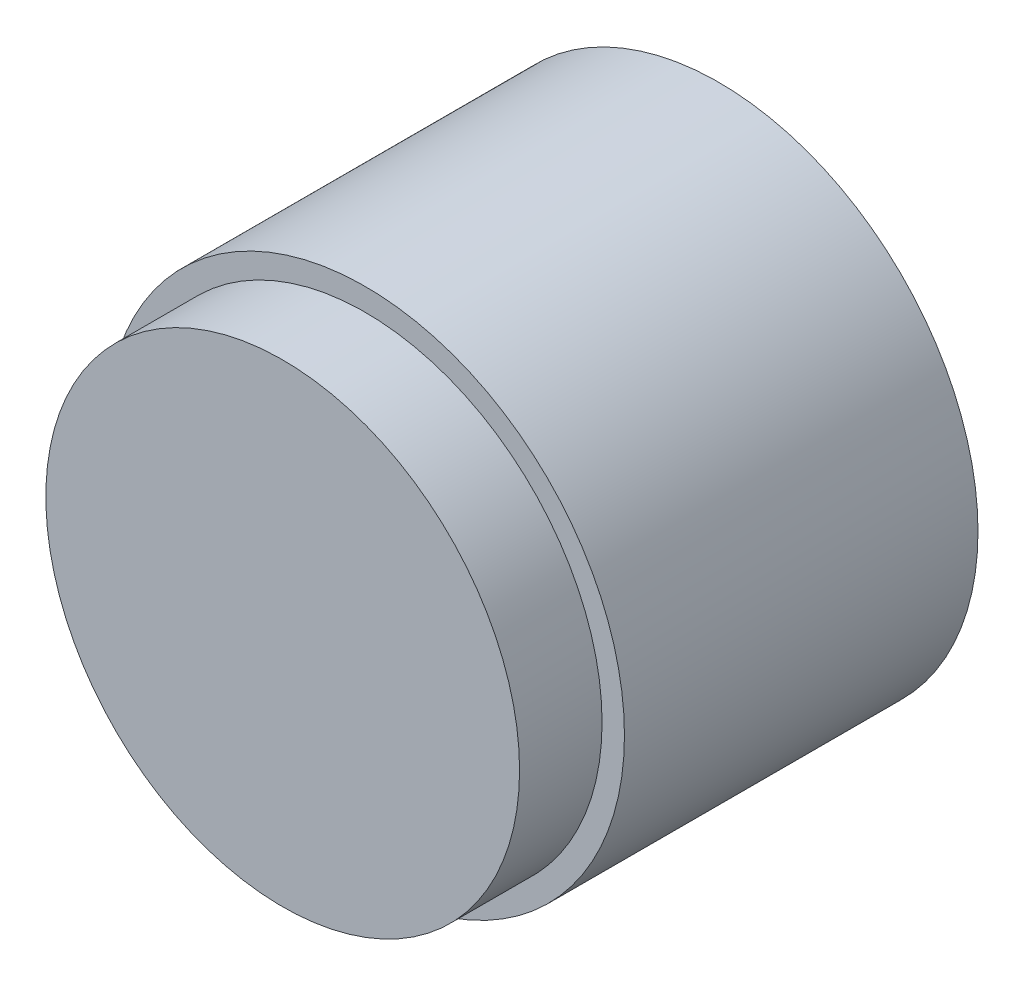
ISO-10303-21;
HEADER;
FILE_DESCRIPTION(('STEP AP214'),'2;1');
FILE_NAME('part.step','',(''),(''),'','','');
FILE_SCHEMA(('AUTOMOTIVE_DESIGN { 1 0 10303 214 1 1 1 1 }'));
ENDSEC;
DATA;
#1=APPLICATION_CONTEXT('core data for automotive mechanical design processes');
#2=APPLICATION_PROTOCOL_DEFINITION('international standard','automotive_design',2000,#1);
#3=PRODUCT_CONTEXT('',#1,'mechanical');
#4=PRODUCT('Part','Part','',(#3));
#5=PRODUCT_RELATED_PRODUCT_CATEGORY('part','',(#4));
#6=PRODUCT_DEFINITION_FORMATION('','',#4);
#7=PRODUCT_DEFINITION_CONTEXT('part definition',#1,'design');
#8=PRODUCT_DEFINITION('design','',#6,#7);
#9=PRODUCT_DEFINITION_SHAPE('','',#8);
#10=(LENGTH_UNIT() NAMED_UNIT(*) SI_UNIT(.MILLI.,.METRE.));
#11=(NAMED_UNIT(*) PLANE_ANGLE_UNIT() SI_UNIT($,.RADIAN.));
#12=(NAMED_UNIT(*) SI_UNIT($,.STERADIAN.) SOLID_ANGLE_UNIT());
#13=UNCERTAINTY_MEASURE_WITH_UNIT(LENGTH_MEASURE(1.E-05),#10,'distance_accuracy_value','');
#14=(GEOMETRIC_REPRESENTATION_CONTEXT(3) GLOBAL_UNCERTAINTY_ASSIGNED_CONTEXT((#13)) GLOBAL_UNIT_ASSIGNED_CONTEXT((#10,
#11,#12)) REPRESENTATION_CONTEXT('',''));
#15=CARTESIAN_POINT('',(0.,0.,0.));
#16=DIRECTION('',(0.,0.,1.));
#17=DIRECTION('',(1.,0.,0.));
#18=AXIS2_PLACEMENT_3D('',#15,#16,#17);
#19=CARTESIAN_POINT('',(0.,0.,15.));
#20=DIRECTION('',(0.,0.,-1.));
#21=DIRECTION('',(-1.,0.,0.));
#22=AXIS2_PLACEMENT_3D('',#19,#20,#21);
#23=CYLINDRICAL_SURFACE('',#22,11.);
#24=CARTESIAN_POINT('',(0.,0.,15.));
#25=DIRECTION('',(0.,0.,1.));
#26=DIRECTION('',(1.,0.,0.));
#27=AXIS2_PLACEMENT_3D('',#24,#25,#26);
#28=CIRCLE('',#27,11.);
#29=CARTESIAN_POINT('',(11.,0.,15.));
#30=VERTEX_POINT('',#29);
#31=EDGE_CURVE('E51',#30,#30,#28,.T.);
#32=ORIENTED_EDGE('',*,*,#31,.F.);
#33=EDGE_LOOP('',(#32));
#34=FACE_BOUND('',#33,.T.);
#35=CARTESIAN_POINT('',(0.,0.,0.));
#36=DIRECTION('',(0.,0.,1.));
#37=DIRECTION('',(1.,0.,0.));
#38=AXIS2_PLACEMENT_3D('',#35,#36,#37);
#39=CIRCLE('',#38,11.);
#40=CARTESIAN_POINT('',(11.,0.,0.));
#41=VERTEX_POINT('',#40);
#42=EDGE_CURVE('E46',#41,#41,#39,.T.);
#43=ORIENTED_EDGE('',*,*,#42,.T.);
#44=EDGE_LOOP('',(#43));
#45=FACE_BOUND('',#44,.T.);
#46=ADVANCED_FACE('F43',(#34,#45),#23,.T.);
#47=CARTESIAN_POINT('',(0.,0.,15.));
#48=DIRECTION('',(0.,0.,1.));
#49=DIRECTION('',(1.,0.,0.));
#50=AXIS2_PLACEMENT_3D('',#47,#48,#49);
#51=PLANE('',#50);
#52=CARTESIAN_POINT('',(0.,0.,15.));
#53=DIRECTION('',(0.,0.,1.));
#54=DIRECTION('',(1.,0.,0.));
#55=AXIS2_PLACEMENT_3D('',#52,#53,#54);
#56=CIRCLE('',#55,10.05);
#57=CARTESIAN_POINT('',(10.05,0.,15.));
#58=VERTEX_POINT('',#57);
#59=EDGE_CURVE('E10',#58,#58,#56,.T.);
#60=ORIENTED_EDGE('',*,*,#59,.F.);
#61=EDGE_LOOP('',(#60));
#62=FACE_BOUND('',#61,.T.);
#63=ORIENTED_EDGE('',*,*,#31,.T.);
#64=EDGE_LOOP('',(#63));
#65=FACE_BOUND('',#64,.T.);
#66=ADVANCED_FACE('F71',(#62,#65),#51,.T.);
#67=CARTESIAN_POINT('',(0.,0.,0.));
#68=DIRECTION('',(0.,0.,1.));
#69=DIRECTION('',(1.,0.,0.));
#70=AXIS2_PLACEMENT_3D('',#67,#68,#69);
#71=PLANE('',#70);
#72=ORIENTED_EDGE('',*,*,#42,.F.);
#73=EDGE_LOOP('',(#72));
#74=FACE_BOUND('',#73,.T.);
#75=ADVANCED_FACE('F68',(#74),#71,.F.);
#76=CARTESIAN_POINT('',(0.,0.,18.5));
#77=DIRECTION('',(0.,0.,-1.));
#78=DIRECTION('',(-1.,0.,0.));
#79=AXIS2_PLACEMENT_3D('',#76,#77,#78);
#80=CYLINDRICAL_SURFACE('',#79,10.05);
#81=CARTESIAN_POINT('',(0.,0.,18.5));
#82=DIRECTION('',(0.,0.,1.));
#83=DIRECTION('',(1.,0.,0.));
#84=AXIS2_PLACEMENT_3D('',#81,#82,#83);
#85=CIRCLE('',#84,10.05);
#86=CARTESIAN_POINT('',(10.05,0.,18.5));
#87=VERTEX_POINT('',#86);
#88=EDGE_CURVE('E58',#87,#87,#85,.T.);
#89=ORIENTED_EDGE('',*,*,#88,.F.);
#90=EDGE_LOOP('',(#89));
#91=FACE_BOUND('',#90,.T.);
#92=ORIENTED_EDGE('',*,*,#59,.T.);
#93=EDGE_LOOP('',(#92));
#94=FACE_BOUND('',#93,.T.);
#95=ADVANCED_FACE('F70',(#91,#94),#80,.T.);
#96=CARTESIAN_POINT('',(0.,0.,18.5));
#97=DIRECTION('',(0.,0.,1.));
#98=DIRECTION('',(1.,0.,0.));
#99=AXIS2_PLACEMENT_3D('',#96,#97,#98);
#100=PLANE('',#99);
#101=ORIENTED_EDGE('',*,*,#88,.T.);
#102=EDGE_LOOP('',(#101));
#103=FACE_BOUND('',#102,.T.);
#104=ADVANCED_FACE('F77',(#103),#100,.T.);
#105=CLOSED_SHELL('',(#46,#66,#75,#95,#104));
#106=MANIFOLD_SOLID_BREP('B2',#105);
#107=ADVANCED_BREP_SHAPE_REPRESENTATION('',(#18,#106),#14);
#108=SHAPE_DEFINITION_REPRESENTATION(#9,#107);
ENDSEC;
END-ISO-10303-21;
